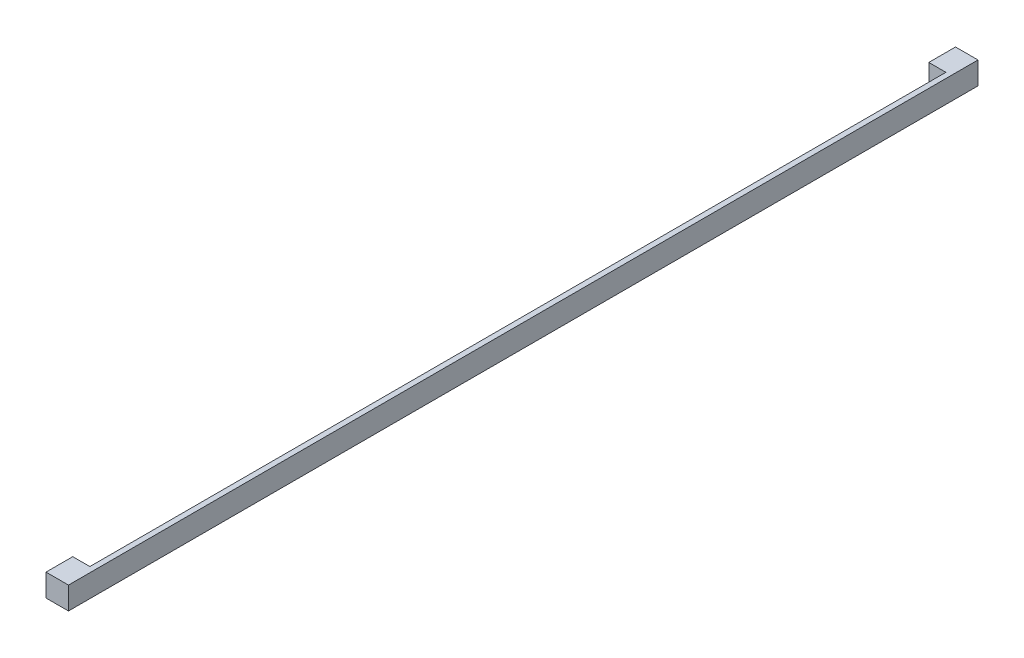
ISO-10303-21;
HEADER;
FILE_DESCRIPTION(('STEP AP214'),'2;1');
FILE_NAME('part.step','',(''),(''),'','','');
FILE_SCHEMA(('AUTOMOTIVE_DESIGN { 1 0 10303 214 1 1 1 1 }'));
ENDSEC;
DATA;
#1=APPLICATION_CONTEXT('core data for automotive mechanical design processes');
#2=APPLICATION_PROTOCOL_DEFINITION('international standard','automotive_design',2000,#1);
#3=PRODUCT_CONTEXT('',#1,'mechanical');
#4=PRODUCT('Part','Part','',(#3));
#5=PRODUCT_RELATED_PRODUCT_CATEGORY('part','',(#4));
#6=PRODUCT_DEFINITION_FORMATION('','',#4);
#7=PRODUCT_DEFINITION_CONTEXT('part definition',#1,'design');
#8=PRODUCT_DEFINITION('design','',#6,#7);
#9=PRODUCT_DEFINITION_SHAPE('','',#8);
#10=(LENGTH_UNIT() NAMED_UNIT(*) SI_UNIT(.MILLI.,.METRE.));
#11=(NAMED_UNIT(*) PLANE_ANGLE_UNIT() SI_UNIT($,.RADIAN.));
#12=(NAMED_UNIT(*) SI_UNIT($,.STERADIAN.) SOLID_ANGLE_UNIT());
#13=UNCERTAINTY_MEASURE_WITH_UNIT(LENGTH_MEASURE(1.E-05),#10,'distance_accuracy_value','');
#14=(GEOMETRIC_REPRESENTATION_CONTEXT(3) GLOBAL_UNCERTAINTY_ASSIGNED_CONTEXT((#13)) GLOBAL_UNIT_ASSIGNED_CONTEXT((#10,
#11,#12)) REPRESENTATION_CONTEXT('',''));
#15=CARTESIAN_POINT('',(0.,0.,0.));
#16=DIRECTION('',(0.,0.,1.));
#17=DIRECTION('',(1.,0.,0.));
#18=AXIS2_PLACEMENT_3D('',#15,#16,#17);
#19=CARTESIAN_POINT('',(4.2,-4.2,340.));
#20=DIRECTION('',(-1.,0.,0.));
#21=DIRECTION('',(0.,0.,1.));
#22=AXIS2_PLACEMENT_3D('',#19,#20,#21);
#23=PLANE('',#22);
#24=DIRECTION('',(0.,1.,0.));
#25=VECTOR('',#24,1.);
#26=CARTESIAN_POINT('',(4.2,-4.2,0.));
#27=LINE('',#26,#25);
#28=CARTESIAN_POINT('',(4.2,-4.2,0.));
#29=VERTEX_POINT('',#28);
#30=CARTESIAN_POINT('',(4.2,4.2,0.));
#31=VERTEX_POINT('',#30);
#32=EDGE_CURVE('E137',#29,#31,#27,.T.);
#33=ORIENTED_EDGE('',*,*,#32,.T.);
#34=DIRECTION('',(0.,0.,-1.));
#35=VECTOR('',#34,1.);
#36=CARTESIAN_POINT('',(4.2,4.2,340.));
#37=LINE('',#36,#35);
#38=CARTESIAN_POINT('',(4.2,4.2,340.));
#39=VERTEX_POINT('',#38);
#40=EDGE_CURVE('E161',#39,#31,#37,.T.);
#41=ORIENTED_EDGE('',*,*,#40,.F.);
#42=DIRECTION('',(0.,1.,0.));
#43=VECTOR('',#42,1.);
#44=CARTESIAN_POINT('',(4.2,-4.2,340.));
#45=LINE('',#44,#43);
#46=CARTESIAN_POINT('',(4.2,-4.2,340.));
#47=VERTEX_POINT('',#46);
#48=EDGE_CURVE('E139',#47,#39,#45,.T.);
#49=ORIENTED_EDGE('',*,*,#48,.F.);
#50=DIRECTION('',(0.,0.,-1.));
#51=VECTOR('',#50,1.);
#52=CARTESIAN_POINT('',(4.2,-4.2,340.));
#53=LINE('',#52,#51);
#54=EDGE_CURVE('E145',#47,#29,#53,.T.);
#55=ORIENTED_EDGE('',*,*,#54,.T.);
#56=EDGE_LOOP('',(#33,#41,#49,#55));
#57=FACE_BOUND('',#56,.T.);
#58=ADVANCED_FACE('F35',(#57),#23,.F.);
#59=CARTESIAN_POINT('',(-4.2,4.2,340.));
#60=DIRECTION('',(0.,-1.,0.));
#61=DIRECTION('',(0.,0.,-1.));
#62=AXIS2_PLACEMENT_3D('',#59,#60,#61);
#63=PLANE('',#62);
#64=DIRECTION('',(0.,0.,-1.));
#65=VECTOR('',#64,1.);
#66=CARTESIAN_POINT('',(-4.2,4.2,340.));
#67=LINE('',#66,#65);
#68=CARTESIAN_POINT('',(-4.2,4.2,10.));
#69=VERTEX_POINT('',#68);
#70=CARTESIAN_POINT('',(-4.2,4.2,0.));
#71=VERTEX_POINT('',#70);
#72=EDGE_CURVE('E157',#69,#71,#67,.T.);
#73=ORIENTED_EDGE('',*,*,#72,.F.);
#74=DIRECTION('',(-1.,0.,0.));
#75=VECTOR('',#74,1.);
#76=CARTESIAN_POINT('',(-14.8600970127145,4.2,10.));
#77=LINE('',#76,#75);
#78=CARTESIAN_POINT('',(2.2,4.2,10.));
#79=VERTEX_POINT('',#78);
#80=EDGE_CURVE('E117',#79,#69,#77,.T.);
#81=ORIENTED_EDGE('',*,*,#80,.F.);
#82=DIRECTION('',(0.,0.,-1.));
#83=VECTOR('',#82,1.);
#84=CARTESIAN_POINT('',(2.2,4.2,10.));
#85=LINE('',#84,#83);
#86=CARTESIAN_POINT('',(2.20000000000004,4.2,330.));
#87=VERTEX_POINT('',#86);
#88=EDGE_CURVE('E134',#87,#79,#85,.T.);
#89=ORIENTED_EDGE('',*,*,#88,.F.);
#90=DIRECTION('',(1.,0.,0.));
#91=VECTOR('',#90,1.);
#92=CARTESIAN_POINT('',(-14.8600970127145,4.2,330.));
#93=LINE('',#92,#91);
#94=CARTESIAN_POINT('',(-4.2,4.2,330.));
#95=VERTEX_POINT('',#94);
#96=EDGE_CURVE('E123',#95,#87,#93,.T.);
#97=ORIENTED_EDGE('',*,*,#96,.F.);
#98=CARTESIAN_POINT('',(-4.2,4.2,340.));
#99=VERTEX_POINT('',#98);
#100=EDGE_CURVE('E158',#99,#95,#67,.T.);
#101=ORIENTED_EDGE('',*,*,#100,.F.);
#102=DIRECTION('',(-1.,0.,0.));
#103=VECTOR('',#102,1.);
#104=CARTESIAN_POINT('',(-4.2,4.2,340.));
#105=LINE('',#104,#103);
#106=EDGE_CURVE('E87',#39,#99,#105,.T.);
#107=ORIENTED_EDGE('',*,*,#106,.F.);
#108=ORIENTED_EDGE('',*,*,#40,.T.);
#109=DIRECTION('',(-1.,0.,0.));
#110=VECTOR('',#109,1.);
#111=CARTESIAN_POINT('',(-4.2,4.2,0.));
#112=LINE('',#111,#110);
#113=EDGE_CURVE('E148',#31,#71,#112,.T.);
#114=ORIENTED_EDGE('',*,*,#113,.T.);
#115=EDGE_LOOP('',(#73,#81,#89,#97,#101,#107,#108,#114));
#116=FACE_BOUND('',#115,.T.);
#117=ADVANCED_FACE('F167',(#116),#63,.F.);
#118=CARTESIAN_POINT('',(-4.2,-4.2,340.));
#119=DIRECTION('',(1.,0.,0.));
#120=DIRECTION('',(0.,0.,-1.));
#121=AXIS2_PLACEMENT_3D('',#118,#119,#120);
#122=PLANE('',#121);
#123=DIRECTION('',(0.,0.,1.));
#124=VECTOR('',#123,1.);
#125=CARTESIAN_POINT('',(-4.2,-2.2,340.));
#126=LINE('',#125,#124);
#127=CARTESIAN_POINT('',(-4.2,-2.2,9.99999999999995));
#128=VERTEX_POINT('',#127);
#129=CARTESIAN_POINT('',(-4.2,-2.2,330.));
#130=VERTEX_POINT('',#129);
#131=EDGE_CURVE('E114',#128,#130,#126,.T.);
#132=ORIENTED_EDGE('',*,*,#131,.F.);
#133=DIRECTION('',(0.,1.,0.));
#134=VECTOR('',#133,1.);
#135=CARTESIAN_POINT('',(-4.2,-4.2,10.));
#136=LINE('',#135,#134);
#137=EDGE_CURVE('E11',#128,#69,#136,.T.);
#138=ORIENTED_EDGE('',*,*,#137,.T.);
#139=ORIENTED_EDGE('',*,*,#72,.T.);
#140=DIRECTION('',(0.,-1.,0.));
#141=VECTOR('',#140,1.);
#142=CARTESIAN_POINT('',(-4.2,-4.2,0.));
#143=LINE('',#142,#141);
#144=CARTESIAN_POINT('',(-4.2,-4.2,0.));
#145=VERTEX_POINT('',#144);
#146=EDGE_CURVE('E151',#71,#145,#143,.T.);
#147=ORIENTED_EDGE('',*,*,#146,.T.);
#148=DIRECTION('',(0.,0.,-1.));
#149=VECTOR('',#148,1.);
#150=CARTESIAN_POINT('',(-4.2,-4.2,340.));
#151=LINE('',#150,#149);
#152=CARTESIAN_POINT('',(-4.2,-4.2,340.));
#153=VERTEX_POINT('',#152);
#154=EDGE_CURVE('E155',#153,#145,#151,.T.);
#155=ORIENTED_EDGE('',*,*,#154,.F.);
#156=DIRECTION('',(0.,-1.,0.));
#157=VECTOR('',#156,1.);
#158=CARTESIAN_POINT('',(-4.2,-4.2,340.));
#159=LINE('',#158,#157);
#160=EDGE_CURVE('E142',#99,#153,#159,.T.);
#161=ORIENTED_EDGE('',*,*,#160,.F.);
#162=ORIENTED_EDGE('',*,*,#100,.T.);
#163=DIRECTION('',(0.,-1.,0.));
#164=VECTOR('',#163,1.);
#165=CARTESIAN_POINT('',(-4.2,-4.2,330.));
#166=LINE('',#165,#164);
#167=EDGE_CURVE('E42',#95,#130,#166,.T.);
#168=ORIENTED_EDGE('',*,*,#167,.T.);
#169=EDGE_LOOP('',(#132,#138,#139,#147,#155,#161,#162,#168));
#170=FACE_BOUND('',#169,.T.);
#171=ADVANCED_FACE('F164',(#170),#122,.F.);
#172=CARTESIAN_POINT('',(-4.2,-4.2,340.));
#173=DIRECTION('',(0.,1.,0.));
#174=DIRECTION('',(0.,0.,1.));
#175=AXIS2_PLACEMENT_3D('',#172,#173,#174);
#176=PLANE('',#175);
#177=DIRECTION('',(1.,0.,0.));
#178=VECTOR('',#177,1.);
#179=CARTESIAN_POINT('',(-4.2,-4.2,0.));
#180=LINE('',#179,#178);
#181=EDGE_CURVE('E79',#145,#29,#180,.T.);
#182=ORIENTED_EDGE('',*,*,#181,.T.);
#183=ORIENTED_EDGE('',*,*,#54,.F.);
#184=DIRECTION('',(1.,0.,0.));
#185=VECTOR('',#184,1.);
#186=CARTESIAN_POINT('',(-4.2,-4.2,340.));
#187=LINE('',#186,#185);
#188=EDGE_CURVE('E58',#153,#47,#187,.T.);
#189=ORIENTED_EDGE('',*,*,#188,.F.);
#190=ORIENTED_EDGE('',*,*,#154,.T.);
#191=EDGE_LOOP('',(#182,#183,#189,#190));
#192=FACE_BOUND('',#191,.T.);
#193=ADVANCED_FACE('F179',(#192),#176,.F.);
#194=CARTESIAN_POINT('',(0.,0.,340.));
#195=DIRECTION('',(0.,0.,-1.));
#196=DIRECTION('',(-1.,0.,0.));
#197=AXIS2_PLACEMENT_3D('',#194,#195,#196);
#198=PLANE('',#197);
#199=ORIENTED_EDGE('',*,*,#48,.T.);
#200=ORIENTED_EDGE('',*,*,#106,.T.);
#201=ORIENTED_EDGE('',*,*,#160,.T.);
#202=ORIENTED_EDGE('',*,*,#188,.T.);
#203=EDGE_LOOP('',(#199,#200,#201,#202));
#204=FACE_BOUND('',#203,.T.);
#205=ADVANCED_FACE('F180',(#204),#198,.F.);
#206=CARTESIAN_POINT('',(0.,0.,0.));
#207=DIRECTION('',(0.,0.,-1.));
#208=DIRECTION('',(-1.,0.,0.));
#209=AXIS2_PLACEMENT_3D('',#206,#207,#208);
#210=PLANE('',#209);
#211=ORIENTED_EDGE('',*,*,#32,.F.);
#212=ORIENTED_EDGE('',*,*,#181,.F.);
#213=ORIENTED_EDGE('',*,*,#146,.F.);
#214=ORIENTED_EDGE('',*,*,#113,.F.);
#215=EDGE_LOOP('',(#211,#212,#213,#214));
#216=FACE_BOUND('',#215,.T.);
#217=ADVANCED_FACE('F176',(#216),#210,.T.);
#218=CARTESIAN_POINT('',(-14.8600970127145,-2.2,10.));
#219=DIRECTION('',(0.,0.,-1.));
#220=DIRECTION('',(-1.,0.,0.));
#221=AXIS2_PLACEMENT_3D('',#218,#219,#220);
#222=PLANE('',#221);
#223=DIRECTION('',(-1.,0.,0.));
#224=VECTOR('',#223,1.);
#225=CARTESIAN_POINT('',(-14.8600970127145,-2.2,10.));
#226=LINE('',#225,#224);
#227=CARTESIAN_POINT('',(2.2,-2.2,10.));
#228=VERTEX_POINT('',#227);
#229=EDGE_CURVE('E49',#228,#128,#226,.T.);
#230=ORIENTED_EDGE('',*,*,#229,.F.);
#231=DIRECTION('',(0.,1.,0.));
#232=VECTOR('',#231,1.);
#233=CARTESIAN_POINT('',(2.2,-2.2,10.));
#234=LINE('',#233,#232);
#235=EDGE_CURVE('E127',#228,#79,#234,.T.);
#236=ORIENTED_EDGE('',*,*,#235,.T.);
#237=ORIENTED_EDGE('',*,*,#80,.T.);
#238=ORIENTED_EDGE('',*,*,#137,.F.);
#239=EDGE_LOOP('',(#230,#236,#237,#238));
#240=FACE_BOUND('',#239,.T.);
#241=ADVANCED_FACE('F170',(#240),#222,.F.);
#242=CARTESIAN_POINT('',(-14.8600970127145,-2.2,330.));
#243=DIRECTION('',(0.,0.,1.));
#244=DIRECTION('',(1.,0.,0.));
#245=AXIS2_PLACEMENT_3D('',#242,#243,#244);
#246=PLANE('',#245);
#247=ORIENTED_EDGE('',*,*,#96,.T.);
#248=DIRECTION('',(0.,1.,0.));
#249=VECTOR('',#248,1.);
#250=CARTESIAN_POINT('',(2.20000000000004,-2.2,330.));
#251=LINE('',#250,#249);
#252=CARTESIAN_POINT('',(2.20000000000004,-2.2,330.));
#253=VERTEX_POINT('',#252);
#254=EDGE_CURVE('E120',#253,#87,#251,.T.);
#255=ORIENTED_EDGE('',*,*,#254,.F.);
#256=DIRECTION('',(1.,0.,0.));
#257=VECTOR('',#256,1.);
#258=CARTESIAN_POINT('',(-14.8600970127145,-2.2,330.));
#259=LINE('',#258,#257);
#260=EDGE_CURVE('E108',#130,#253,#259,.T.);
#261=ORIENTED_EDGE('',*,*,#260,.F.);
#262=ORIENTED_EDGE('',*,*,#167,.F.);
#263=EDGE_LOOP('',(#247,#255,#261,#262));
#264=FACE_BOUND('',#263,.T.);
#265=ADVANCED_FACE('F121',(#264),#246,.F.);
#266=CARTESIAN_POINT('',(0.,-2.2,0.));
#267=DIRECTION('',(0.,1.,0.));
#268=DIRECTION('',(0.,0.,1.));
#269=AXIS2_PLACEMENT_3D('',#266,#267,#268);
#270=PLANE('',#269);
#271=ORIENTED_EDGE('',*,*,#131,.T.);
#272=ORIENTED_EDGE('',*,*,#260,.T.);
#273=DIRECTION('',(0.,0.,-1.));
#274=VECTOR('',#273,1.);
#275=CARTESIAN_POINT('',(2.2,-2.2,10.));
#276=LINE('',#275,#274);
#277=EDGE_CURVE('E112',#253,#228,#276,.T.);
#278=ORIENTED_EDGE('',*,*,#277,.T.);
#279=ORIENTED_EDGE('',*,*,#229,.T.);
#280=EDGE_LOOP('',(#271,#272,#278,#279));
#281=FACE_BOUND('',#280,.T.);
#282=ADVANCED_FACE('F110',(#281),#270,.T.);
#283=CARTESIAN_POINT('',(2.2,-2.2,10.));
#284=DIRECTION('',(1.,0.,0.));
#285=DIRECTION('',(0.,0.,-1.));
#286=AXIS2_PLACEMENT_3D('',#283,#284,#285);
#287=PLANE('',#286);
#288=ORIENTED_EDGE('',*,*,#88,.T.);
#289=ORIENTED_EDGE('',*,*,#235,.F.);
#290=ORIENTED_EDGE('',*,*,#277,.F.);
#291=ORIENTED_EDGE('',*,*,#254,.T.);
#292=EDGE_LOOP('',(#288,#289,#290,#291));
#293=FACE_BOUND('',#292,.T.);
#294=ADVANCED_FACE('F129',(#293),#287,.F.);
#295=CLOSED_SHELL('',(#58,#117,#171,#193,#205,#217,#241,#265,#282,#294));
#296=MANIFOLD_SOLID_BREP('B2',#295);
#297=ADVANCED_BREP_SHAPE_REPRESENTATION('',(#18,#296),#14);
#298=SHAPE_DEFINITION_REPRESENTATION(#9,#297);
ENDSEC;
END-ISO-10303-21;
